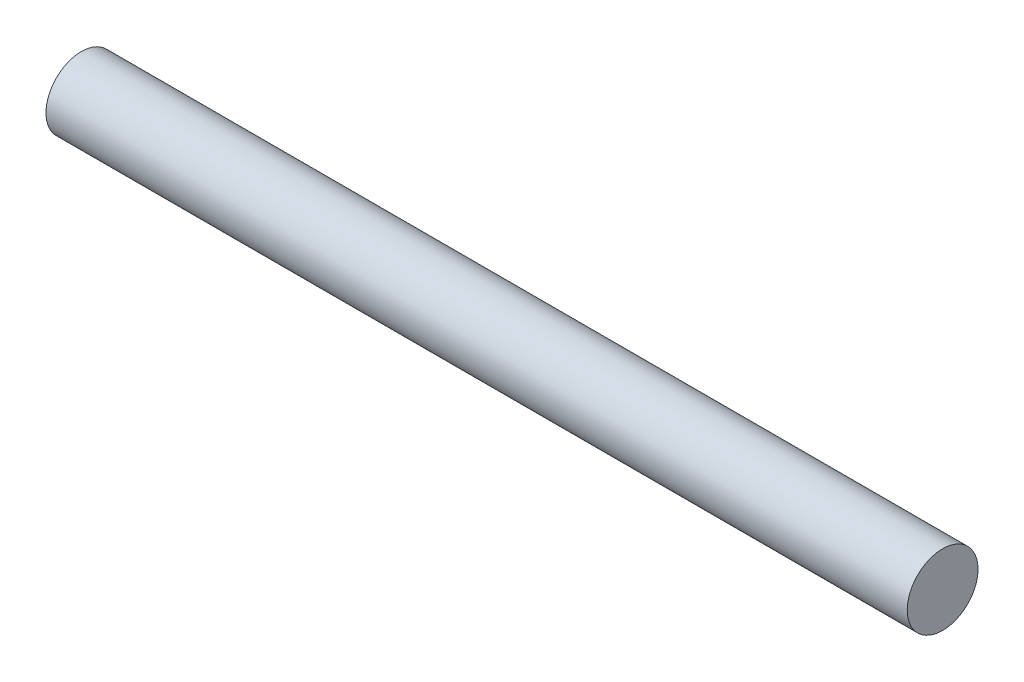
ISO-10303-21;
HEADER;
FILE_DESCRIPTION(('STEP AP214'),'2;1');
FILE_NAME('part.step','',(''),(''),'','','');
FILE_SCHEMA(('AUTOMOTIVE_DESIGN { 1 0 10303 214 1 1 1 1 }'));
ENDSEC;
DATA;
#1=APPLICATION_CONTEXT('core data for automotive mechanical design processes');
#2=APPLICATION_PROTOCOL_DEFINITION('international standard','automotive_design',2000,#1);
#3=PRODUCT_CONTEXT('',#1,'mechanical');
#4=PRODUCT('Part','Part','',(#3));
#5=PRODUCT_RELATED_PRODUCT_CATEGORY('part','',(#4));
#6=PRODUCT_DEFINITION_FORMATION('','',#4);
#7=PRODUCT_DEFINITION_CONTEXT('part definition',#1,'design');
#8=PRODUCT_DEFINITION('design','',#6,#7);
#9=PRODUCT_DEFINITION_SHAPE('','',#8);
#10=(LENGTH_UNIT() NAMED_UNIT(*) SI_UNIT(.MILLI.,.METRE.));
#11=(NAMED_UNIT(*) PLANE_ANGLE_UNIT() SI_UNIT($,.RADIAN.));
#12=(NAMED_UNIT(*) SI_UNIT($,.STERADIAN.) SOLID_ANGLE_UNIT());
#13=UNCERTAINTY_MEASURE_WITH_UNIT(LENGTH_MEASURE(1.E-05),#10,'distance_accuracy_value','');
#14=(GEOMETRIC_REPRESENTATION_CONTEXT(3) GLOBAL_UNCERTAINTY_ASSIGNED_CONTEXT((#13)) GLOBAL_UNIT_ASSIGNED_CONTEXT((#10,
#11,#12)) REPRESENTATION_CONTEXT('',''));
#15=CARTESIAN_POINT('',(0.,0.,0.));
#16=DIRECTION('',(0.,0.,1.));
#17=DIRECTION('',(1.,0.,0.));
#18=AXIS2_PLACEMENT_3D('',#15,#16,#17);
#19=CARTESIAN_POINT('',(0.,0.,0.));
#20=DIRECTION('',(1.,0.,0.));
#21=DIRECTION('',(0.,0.,-1.));
#22=AXIS2_PLACEMENT_3D('',#19,#20,#21);
#23=PLANE('',#22);
#24=CARTESIAN_POINT('',(0.,0.,0.));
#25=DIRECTION('',(1.,0.,0.));
#26=DIRECTION('',(0.,0.,-1.));
#27=AXIS2_PLACEMENT_3D('',#24,#25,#26);
#28=CIRCLE('',#27,3.57);
#29=CARTESIAN_POINT('',(0.,0.,-3.57));
#30=VERTEX_POINT('',#29);
#31=EDGE_CURVE('E42',#30,#30,#28,.T.);
#32=ORIENTED_EDGE('',*,*,#31,.F.);
#33=EDGE_LOOP('',(#32));
#34=FACE_BOUND('',#33,.T.);
#35=ADVANCED_FACE('F35',(#34),#23,.F.);
#36=CARTESIAN_POINT('',(96.9540626015795,0.,0.));
#37=DIRECTION('',(-1.,0.,0.));
#38=DIRECTION('',(0.,0.,1.));
#39=AXIS2_PLACEMENT_3D('',#36,#37,#38);
#40=CYLINDRICAL_SURFACE('',#39,3.57);
#41=CARTESIAN_POINT('',(86.8565777662356,0.,0.));
#42=DIRECTION('',(-1.,0.,0.));
#43=DIRECTION('',(0.,-1.,0.));
#44=AXIS2_PLACEMENT_3D('',#41,#42,#43);
#45=CIRCLE('',#44,3.57);
#46=CARTESIAN_POINT('',(86.8565777662356,-3.57,0.));
#47=VERTEX_POINT('',#46);
#48=EDGE_CURVE('E10',#47,#47,#45,.T.);
#49=ORIENTED_EDGE('',*,*,#48,.T.);
#50=EDGE_LOOP('',(#49));
#51=FACE_BOUND('',#50,.T.);
#52=ORIENTED_EDGE('',*,*,#31,.T.);
#53=EDGE_LOOP('',(#52));
#54=FACE_BOUND('',#53,.T.);
#55=ADVANCED_FACE('F37',(#51,#54),#40,.T.);
#56=CARTESIAN_POINT('',(86.8565777662356,-3.57187499999982,0.));
#57=DIRECTION('',(-1.,0.,0.));
#58=DIRECTION('',(0.,0.,-1.));
#59=AXIS2_PLACEMENT_3D('',#56,#57,#58);
#60=PLANE('',#59);
#61=ORIENTED_EDGE('',*,*,#48,.F.);
#62=EDGE_LOOP('',(#61));
#63=FACE_BOUND('',#62,.T.);
#64=ADVANCED_FACE('F53',(#63),#60,.F.);
#65=CLOSED_SHELL('',(#35,#55,#64));
#66=MANIFOLD_SOLID_BREP('B2',#65);
#67=ADVANCED_BREP_SHAPE_REPRESENTATION('',(#18,#66),#14);
#68=SHAPE_DEFINITION_REPRESENTATION(#9,#67);
ENDSEC;
END-ISO-10303-21;
